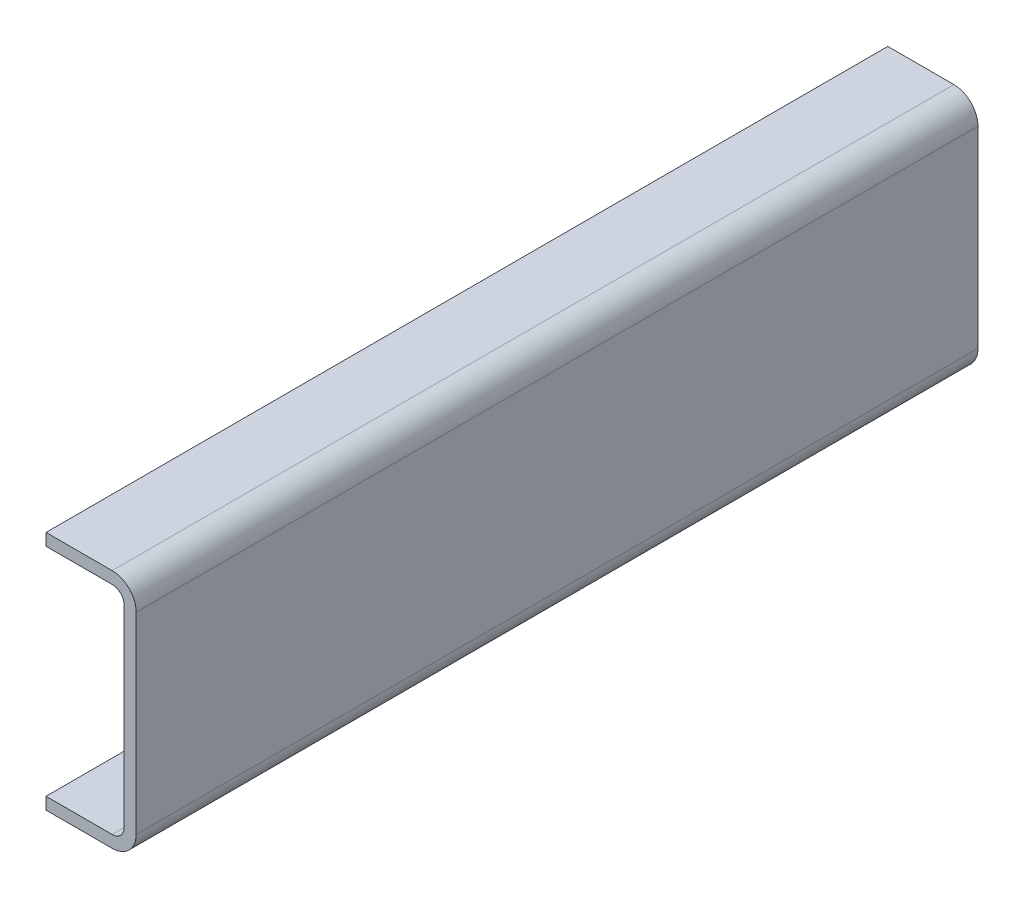
ISO-10303-21;
HEADER;
FILE_DESCRIPTION(('STEP AP214'),'2;1');
FILE_NAME('part.step','',(''),(''),'','','');
FILE_SCHEMA(('AUTOMOTIVE_DESIGN { 1 0 10303 214 1 1 1 1 }'));
ENDSEC;
DATA;
#1=APPLICATION_CONTEXT('core data for automotive mechanical design processes');
#2=APPLICATION_PROTOCOL_DEFINITION('international standard','automotive_design',2000,#1);
#3=PRODUCT_CONTEXT('',#1,'mechanical');
#4=PRODUCT('Part','Part','',(#3));
#5=PRODUCT_RELATED_PRODUCT_CATEGORY('part','',(#4));
#6=PRODUCT_DEFINITION_FORMATION('','',#4);
#7=PRODUCT_DEFINITION_CONTEXT('part definition',#1,'design');
#8=PRODUCT_DEFINITION('design','',#6,#7);
#9=PRODUCT_DEFINITION_SHAPE('','',#8);
#10=(LENGTH_UNIT() NAMED_UNIT(*) SI_UNIT(.MILLI.,.METRE.));
#11=(NAMED_UNIT(*) PLANE_ANGLE_UNIT() SI_UNIT($,.RADIAN.));
#12=(NAMED_UNIT(*) SI_UNIT($,.STERADIAN.) SOLID_ANGLE_UNIT());
#13=UNCERTAINTY_MEASURE_WITH_UNIT(LENGTH_MEASURE(1.E-05),#10,'distance_accuracy_value','');
#14=(GEOMETRIC_REPRESENTATION_CONTEXT(3) GLOBAL_UNCERTAINTY_ASSIGNED_CONTEXT((#13)) GLOBAL_UNIT_ASSIGNED_CONTEXT((#10,
#11,#12)) REPRESENTATION_CONTEXT('',''));
#15=CARTESIAN_POINT('',(0.,0.,0.));
#16=DIRECTION('',(0.,0.,1.));
#17=DIRECTION('',(1.,0.,0.));
#18=AXIS2_PLACEMENT_3D('',#15,#16,#17);
#19=CARTESIAN_POINT('',(-2.54,2.54,88.9));
#20=DIRECTION('',(0.,0.,-1.));
#21=DIRECTION('',(-1.,0.,0.));
#22=AXIS2_PLACEMENT_3D('',#19,#20,#21);
#23=CYLINDRICAL_SURFACE('',#22,2.54);
#24=CARTESIAN_POINT('',(-2.54,2.54,0.));
#25=DIRECTION('',(0.,0.,1.));
#26=DIRECTION('',(-1.,0.,0.));
#27=AXIS2_PLACEMENT_3D('',#24,#25,#26);
#28=CIRCLE('',#27,2.54);
#29=CARTESIAN_POINT('',(-2.54000000000002,0.,0.));
#30=VERTEX_POINT('',#29);
#31=CARTESIAN_POINT('',(0.,2.54000000000002,0.));
#32=VERTEX_POINT('',#31);
#33=EDGE_CURVE('E189',#30,#32,#28,.T.);
#34=ORIENTED_EDGE('',*,*,#33,.T.);
#35=DIRECTION('',(0.,0.,-1.));
#36=VECTOR('',#35,1.);
#37=CARTESIAN_POINT('',(0.,2.54000000000002,88.9));
#38=LINE('',#37,#36);
#39=CARTESIAN_POINT('',(0.,2.54000000000002,88.9));
#40=VERTEX_POINT('',#39);
#41=EDGE_CURVE('E11',#40,#32,#38,.T.);
#42=ORIENTED_EDGE('',*,*,#41,.F.);
#43=CARTESIAN_POINT('',(-2.54,2.54,88.9));
#44=DIRECTION('',(0.,0.,1.));
#45=DIRECTION('',(-1.,0.,0.));
#46=AXIS2_PLACEMENT_3D('',#43,#44,#45);
#47=CIRCLE('',#46,2.54);
#48=CARTESIAN_POINT('',(-2.54000000000002,0.,88.9));
#49=VERTEX_POINT('',#48);
#50=EDGE_CURVE('E223',#49,#40,#47,.T.);
#51=ORIENTED_EDGE('',*,*,#50,.F.);
#52=DIRECTION('',(0.,0.,-1.));
#53=VECTOR('',#52,1.);
#54=CARTESIAN_POINT('',(-2.54000000000002,0.,88.9));
#55=LINE('',#54,#53);
#56=EDGE_CURVE('E185',#49,#30,#55,.T.);
#57=ORIENTED_EDGE('',*,*,#56,.T.);
#58=EDGE_LOOP('',(#34,#42,#51,#57));
#59=FACE_BOUND('',#58,.T.);
#60=ADVANCED_FACE('F40',(#59),#23,.T.);
#61=CARTESIAN_POINT('',(0.,2.54000000000002,88.9));
#62=DIRECTION('',(-1.,0.,0.));
#63=DIRECTION('',(0.,0.,1.));
#64=AXIS2_PLACEMENT_3D('',#61,#62,#63);
#65=PLANE('',#64);
#66=DIRECTION('',(0.,1.,0.));
#67=VECTOR('',#66,1.);
#68=CARTESIAN_POINT('',(0.,2.54000000000002,0.));
#69=LINE('',#68,#67);
#70=CARTESIAN_POINT('',(0.,22.86,0.));
#71=VERTEX_POINT('',#70);
#72=EDGE_CURVE('E193',#32,#71,#69,.T.);
#73=ORIENTED_EDGE('',*,*,#72,.T.);
#74=DIRECTION('',(0.,0.,-1.));
#75=VECTOR('',#74,1.);
#76=CARTESIAN_POINT('',(0.,22.86,88.9));
#77=LINE('',#76,#75);
#78=CARTESIAN_POINT('',(0.,22.86,88.9));
#79=VERTEX_POINT('',#78);
#80=EDGE_CURVE('E49',#79,#71,#77,.T.);
#81=ORIENTED_EDGE('',*,*,#80,.F.);
#82=DIRECTION('',(0.,1.,0.));
#83=VECTOR('',#82,1.);
#84=CARTESIAN_POINT('',(0.,2.54000000000002,88.9));
#85=LINE('',#84,#83);
#86=EDGE_CURVE('E129',#40,#79,#85,.T.);
#87=ORIENTED_EDGE('',*,*,#86,.F.);
#88=ORIENTED_EDGE('',*,*,#41,.T.);
#89=EDGE_LOOP('',(#73,#81,#87,#88));
#90=FACE_BOUND('',#89,.T.);
#91=ADVANCED_FACE('F301',(#90),#65,.F.);
#92=CARTESIAN_POINT('',(-2.54,22.86,88.9));
#93=DIRECTION('',(0.,0.,-1.));
#94=DIRECTION('',(-1.,0.,0.));
#95=AXIS2_PLACEMENT_3D('',#92,#93,#94);
#96=CYLINDRICAL_SURFACE('',#95,2.54);
#97=CARTESIAN_POINT('',(-2.54,22.86,0.));
#98=DIRECTION('',(0.,0.,1.));
#99=DIRECTION('',(1.,0.,0.));
#100=AXIS2_PLACEMENT_3D('',#97,#98,#99);
#101=CIRCLE('',#100,2.54);
#102=CARTESIAN_POINT('',(-2.54000000000002,25.4,0.));
#103=VERTEX_POINT('',#102);
#104=EDGE_CURVE('E196',#71,#103,#101,.T.);
#105=ORIENTED_EDGE('',*,*,#104,.T.);
#106=DIRECTION('',(0.,0.,-1.));
#107=VECTOR('',#106,1.);
#108=CARTESIAN_POINT('',(-2.54000000000002,25.4,88.9));
#109=LINE('',#108,#107);
#110=CARTESIAN_POINT('',(-2.54000000000002,25.4,88.9));
#111=VERTEX_POINT('',#110);
#112=EDGE_CURVE('E250',#111,#103,#109,.T.);
#113=ORIENTED_EDGE('',*,*,#112,.F.);
#114=CARTESIAN_POINT('',(-2.54,22.86,88.9));
#115=DIRECTION('',(0.,0.,1.));
#116=DIRECTION('',(1.,0.,0.));
#117=AXIS2_PLACEMENT_3D('',#114,#115,#116);
#118=CIRCLE('',#117,2.54);
#119=EDGE_CURVE('E261',#79,#111,#118,.T.);
#120=ORIENTED_EDGE('',*,*,#119,.F.);
#121=ORIENTED_EDGE('',*,*,#80,.T.);
#122=EDGE_LOOP('',(#105,#113,#120,#121));
#123=FACE_BOUND('',#122,.T.);
#124=ADVANCED_FACE('F259',(#123),#96,.T.);
#125=CARTESIAN_POINT('',(-2.54000000000002,25.4,88.9));
#126=DIRECTION('',(0.,-1.,0.));
#127=DIRECTION('',(0.,0.,-1.));
#128=AXIS2_PLACEMENT_3D('',#125,#126,#127);
#129=PLANE('',#128);
#130=DIRECTION('',(-1.,0.,0.));
#131=VECTOR('',#130,1.);
#132=CARTESIAN_POINT('',(-2.54000000000002,25.4,0.));
#133=LINE('',#132,#131);
#134=CARTESIAN_POINT('',(-9.525,25.4,0.));
#135=VERTEX_POINT('',#134);
#136=EDGE_CURVE('E199',#103,#135,#133,.T.);
#137=ORIENTED_EDGE('',*,*,#136,.T.);
#138=DIRECTION('',(0.,0.,-1.));
#139=VECTOR('',#138,1.);
#140=CARTESIAN_POINT('',(-9.525,25.4,88.9));
#141=LINE('',#140,#139);
#142=CARTESIAN_POINT('',(-9.525,25.4,88.9));
#143=VERTEX_POINT('',#142);
#144=EDGE_CURVE('E246',#143,#135,#141,.T.);
#145=ORIENTED_EDGE('',*,*,#144,.F.);
#146=DIRECTION('',(-1.,0.,0.));
#147=VECTOR('',#146,1.);
#148=CARTESIAN_POINT('',(-2.54000000000002,25.4,88.9));
#149=LINE('',#148,#147);
#150=EDGE_CURVE('E280',#111,#143,#149,.T.);
#151=ORIENTED_EDGE('',*,*,#150,.F.);
#152=ORIENTED_EDGE('',*,*,#112,.T.);
#153=EDGE_LOOP('',(#137,#145,#151,#152));
#154=FACE_BOUND('',#153,.T.);
#155=ADVANCED_FACE('F270',(#154),#129,.F.);
#156=CARTESIAN_POINT('',(-9.525,25.4,88.9));
#157=DIRECTION('',(1.,0.,0.));
#158=DIRECTION('',(0.,0.,-1.));
#159=AXIS2_PLACEMENT_3D('',#156,#157,#158);
#160=PLANE('',#159);
#161=DIRECTION('',(0.,-1.,0.));
#162=VECTOR('',#161,1.);
#163=CARTESIAN_POINT('',(-9.525,25.4,0.));
#164=LINE('',#163,#162);
#165=CARTESIAN_POINT('',(-9.525,24.13,0.));
#166=VERTEX_POINT('',#165);
#167=EDGE_CURVE('E202',#135,#166,#164,.T.);
#168=ORIENTED_EDGE('',*,*,#167,.T.);
#169=DIRECTION('',(0.,0.,-1.));
#170=VECTOR('',#169,1.);
#171=CARTESIAN_POINT('',(-9.525,24.13,88.9));
#172=LINE('',#171,#170);
#173=CARTESIAN_POINT('',(-9.525,24.13,88.9));
#174=VERTEX_POINT('',#173);
#175=EDGE_CURVE('E242',#174,#166,#172,.T.);
#176=ORIENTED_EDGE('',*,*,#175,.F.);
#177=DIRECTION('',(0.,-1.,0.));
#178=VECTOR('',#177,1.);
#179=CARTESIAN_POINT('',(-9.525,25.4,88.9));
#180=LINE('',#179,#178);
#181=EDGE_CURVE('E276',#143,#174,#180,.T.);
#182=ORIENTED_EDGE('',*,*,#181,.F.);
#183=ORIENTED_EDGE('',*,*,#144,.T.);
#184=EDGE_LOOP('',(#168,#176,#182,#183));
#185=FACE_BOUND('',#184,.T.);
#186=ADVANCED_FACE('F274',(#185),#160,.F.);
#187=CARTESIAN_POINT('',(-2.54000000000001,24.13,88.9));
#188=DIRECTION('',(0.,1.,0.));
#189=DIRECTION('',(0.,0.,1.));
#190=AXIS2_PLACEMENT_3D('',#187,#188,#189);
#191=PLANE('',#190);
#192=DIRECTION('',(1.,0.,0.));
#193=VECTOR('',#192,1.);
#194=CARTESIAN_POINT('',(-2.54000000000001,24.13,0.));
#195=LINE('',#194,#193);
#196=CARTESIAN_POINT('',(-2.54000000000001,24.13,0.));
#197=VERTEX_POINT('',#196);
#198=EDGE_CURVE('E205',#166,#197,#195,.T.);
#199=ORIENTED_EDGE('',*,*,#198,.T.);
#200=DIRECTION('',(0.,0.,-1.));
#201=VECTOR('',#200,1.);
#202=CARTESIAN_POINT('',(-2.54000000000001,24.13,88.9));
#203=LINE('',#202,#201);
#204=CARTESIAN_POINT('',(-2.54000000000001,24.13,88.9));
#205=VERTEX_POINT('',#204);
#206=EDGE_CURVE('E238',#205,#197,#203,.T.);
#207=ORIENTED_EDGE('',*,*,#206,.F.);
#208=DIRECTION('',(1.,0.,0.));
#209=VECTOR('',#208,1.);
#210=CARTESIAN_POINT('',(-2.54000000000001,24.13,88.9));
#211=LINE('',#210,#209);
#212=EDGE_CURVE('E279',#174,#205,#211,.T.);
#213=ORIENTED_EDGE('',*,*,#212,.F.);
#214=ORIENTED_EDGE('',*,*,#175,.T.);
#215=EDGE_LOOP('',(#199,#207,#213,#214));
#216=FACE_BOUND('',#215,.T.);
#217=ADVANCED_FACE('F313',(#216),#191,.F.);
#218=CARTESIAN_POINT('',(-2.54,22.86,88.9));
#219=DIRECTION('',(0.,0.,-1.));
#220=DIRECTION('',(-1.,0.,0.));
#221=AXIS2_PLACEMENT_3D('',#218,#219,#220);
#222=CYLINDRICAL_SURFACE('',#221,1.27);
#223=CARTESIAN_POINT('',(-2.54,22.86,0.));
#224=DIRECTION('',(0.,0.,-1.));
#225=DIRECTION('',(1.,0.,0.));
#226=AXIS2_PLACEMENT_3D('',#223,#224,#225);
#227=CIRCLE('',#226,1.27);
#228=CARTESIAN_POINT('',(-1.27,22.86,0.));
#229=VERTEX_POINT('',#228);
#230=EDGE_CURVE('E208',#197,#229,#227,.T.);
#231=ORIENTED_EDGE('',*,*,#230,.T.);
#232=DIRECTION('',(0.,0.,-1.));
#233=VECTOR('',#232,1.);
#234=CARTESIAN_POINT('',(-1.27,22.86,88.9));
#235=LINE('',#234,#233);
#236=CARTESIAN_POINT('',(-1.27,22.86,88.9));
#237=VERTEX_POINT('',#236);
#238=EDGE_CURVE('E234',#237,#229,#235,.T.);
#239=ORIENTED_EDGE('',*,*,#238,.F.);
#240=CARTESIAN_POINT('',(-2.54,22.86,88.9));
#241=DIRECTION('',(0.,0.,-1.));
#242=DIRECTION('',(1.,0.,0.));
#243=AXIS2_PLACEMENT_3D('',#240,#241,#242);
#244=CIRCLE('',#243,1.27);
#245=EDGE_CURVE('E284',#205,#237,#244,.T.);
#246=ORIENTED_EDGE('',*,*,#245,.F.);
#247=ORIENTED_EDGE('',*,*,#206,.T.);
#248=EDGE_LOOP('',(#231,#239,#246,#247));
#249=FACE_BOUND('',#248,.T.);
#250=ADVANCED_FACE('F316',(#249),#222,.F.);
#251=CARTESIAN_POINT('',(-1.27,2.54000000000001,88.9));
#252=DIRECTION('',(1.,0.,0.));
#253=DIRECTION('',(0.,1.,0.));
#254=AXIS2_PLACEMENT_3D('',#251,#252,#253);
#255=PLANE('',#254);
#256=DIRECTION('',(0.,-1.,0.));
#257=VECTOR('',#256,1.);
#258=CARTESIAN_POINT('',(-1.27,2.54000000000001,0.));
#259=LINE('',#258,#257);
#260=CARTESIAN_POINT('',(-1.27,2.54000000000001,0.));
#261=VERTEX_POINT('',#260);
#262=EDGE_CURVE('E211',#229,#261,#259,.T.);
#263=ORIENTED_EDGE('',*,*,#262,.T.);
#264=DIRECTION('',(0.,0.,-1.));
#265=VECTOR('',#264,1.);
#266=CARTESIAN_POINT('',(-1.27,2.54000000000001,88.9));
#267=LINE('',#266,#265);
#268=CARTESIAN_POINT('',(-1.27,2.54000000000001,88.9));
#269=VERTEX_POINT('',#268);
#270=EDGE_CURVE('E230',#269,#261,#267,.T.);
#271=ORIENTED_EDGE('',*,*,#270,.F.);
#272=DIRECTION('',(0.,-1.,0.));
#273=VECTOR('',#272,1.);
#274=CARTESIAN_POINT('',(-1.27,2.54000000000001,88.9));
#275=LINE('',#274,#273);
#276=EDGE_CURVE('E291',#237,#269,#275,.T.);
#277=ORIENTED_EDGE('',*,*,#276,.F.);
#278=ORIENTED_EDGE('',*,*,#238,.T.);
#279=EDGE_LOOP('',(#263,#271,#277,#278));
#280=FACE_BOUND('',#279,.T.);
#281=ADVANCED_FACE('F320',(#280),#255,.F.);
#282=CARTESIAN_POINT('',(-2.54,2.54,88.9));
#283=DIRECTION('',(0.,0.,-1.));
#284=DIRECTION('',(-1.,0.,0.));
#285=AXIS2_PLACEMENT_3D('',#282,#283,#284);
#286=CYLINDRICAL_SURFACE('',#285,1.27);
#287=CARTESIAN_POINT('',(-2.54,2.54,0.));
#288=DIRECTION('',(0.,0.,-1.));
#289=DIRECTION('',(-1.,0.,0.));
#290=AXIS2_PLACEMENT_3D('',#287,#288,#289);
#291=CIRCLE('',#290,1.27);
#292=CARTESIAN_POINT('',(-2.54000000000002,1.27,0.));
#293=VERTEX_POINT('',#292);
#294=EDGE_CURVE('E214',#261,#293,#291,.T.);
#295=ORIENTED_EDGE('',*,*,#294,.T.);
#296=DIRECTION('',(0.,0.,-1.));
#297=VECTOR('',#296,1.);
#298=CARTESIAN_POINT('',(-2.54000000000002,1.27,88.9));
#299=LINE('',#298,#297);
#300=CARTESIAN_POINT('',(-2.54000000000002,1.27,88.9));
#301=VERTEX_POINT('',#300);
#302=EDGE_CURVE('E178',#301,#293,#299,.T.);
#303=ORIENTED_EDGE('',*,*,#302,.F.);
#304=CARTESIAN_POINT('',(-2.54,2.54,88.9));
#305=DIRECTION('',(0.,0.,-1.));
#306=DIRECTION('',(-1.,0.,0.));
#307=AXIS2_PLACEMENT_3D('',#304,#305,#306);
#308=CIRCLE('',#307,1.27);
#309=EDGE_CURVE('E167',#269,#301,#308,.T.);
#310=ORIENTED_EDGE('',*,*,#309,.F.);
#311=ORIENTED_EDGE('',*,*,#270,.T.);
#312=EDGE_LOOP('',(#295,#303,#310,#311));
#313=FACE_BOUND('',#312,.T.);
#314=ADVANCED_FACE('F324',(#313),#286,.F.);
#315=CARTESIAN_POINT('',(-2.54000000000002,1.27,88.9));
#316=DIRECTION('',(0.,-1.,0.));
#317=DIRECTION('',(0.,0.,-1.));
#318=AXIS2_PLACEMENT_3D('',#315,#316,#317);
#319=PLANE('',#318);
#320=DIRECTION('',(-1.,0.,0.));
#321=VECTOR('',#320,1.);
#322=CARTESIAN_POINT('',(-2.54000000000002,1.27,0.));
#323=LINE('',#322,#321);
#324=CARTESIAN_POINT('',(-9.525,1.27,0.));
#325=VERTEX_POINT('',#324);
#326=EDGE_CURVE('E176',#293,#325,#323,.T.);
#327=ORIENTED_EDGE('',*,*,#326,.T.);
#328=DIRECTION('',(0.,0.,-1.));
#329=VECTOR('',#328,1.);
#330=CARTESIAN_POINT('',(-9.525,1.27,88.9));
#331=LINE('',#330,#329);
#332=CARTESIAN_POINT('',(-9.525,1.27,88.9));
#333=VERTEX_POINT('',#332);
#334=EDGE_CURVE('E173',#333,#325,#331,.T.);
#335=ORIENTED_EDGE('',*,*,#334,.F.);
#336=DIRECTION('',(-1.,0.,0.));
#337=VECTOR('',#336,1.);
#338=CARTESIAN_POINT('',(-2.54000000000002,1.27,88.9));
#339=LINE('',#338,#337);
#340=EDGE_CURVE('E161',#301,#333,#339,.T.);
#341=ORIENTED_EDGE('',*,*,#340,.F.);
#342=ORIENTED_EDGE('',*,*,#302,.T.);
#343=EDGE_LOOP('',(#327,#335,#341,#342));
#344=FACE_BOUND('',#343,.T.);
#345=ADVANCED_FACE('F174',(#344),#319,.F.);
#346=CARTESIAN_POINT('',(-9.525,1.27,88.9));
#347=DIRECTION('',(1.,0.,0.));
#348=DIRECTION('',(0.,0.,-1.));
#349=AXIS2_PLACEMENT_3D('',#346,#347,#348);
#350=PLANE('',#349);
#351=DIRECTION('',(0.,-1.,0.));
#352=VECTOR('',#351,1.);
#353=CARTESIAN_POINT('',(-9.525,1.27,0.));
#354=LINE('',#353,#352);
#355=CARTESIAN_POINT('',(-9.525,0.,0.));
#356=VERTEX_POINT('',#355);
#357=EDGE_CURVE('E112',#325,#356,#354,.T.);
#358=ORIENTED_EDGE('',*,*,#357,.T.);
#359=DIRECTION('',(0.,0.,-1.));
#360=VECTOR('',#359,1.);
#361=CARTESIAN_POINT('',(-9.525,0.,88.9));
#362=LINE('',#361,#360);
#363=CARTESIAN_POINT('',(-9.525,0.,88.9));
#364=VERTEX_POINT('',#363);
#365=EDGE_CURVE('E179',#364,#356,#362,.T.);
#366=ORIENTED_EDGE('',*,*,#365,.F.);
#367=DIRECTION('',(0.,-1.,0.));
#368=VECTOR('',#367,1.);
#369=CARTESIAN_POINT('',(-9.525,1.27,88.9));
#370=LINE('',#369,#368);
#371=EDGE_CURVE('E165',#333,#364,#370,.T.);
#372=ORIENTED_EDGE('',*,*,#371,.F.);
#373=ORIENTED_EDGE('',*,*,#334,.T.);
#374=EDGE_LOOP('',(#358,#366,#372,#373));
#375=FACE_BOUND('',#374,.T.);
#376=ADVANCED_FACE('F181',(#375),#350,.F.);
#377=CARTESIAN_POINT('',(-2.54000000000002,0.,88.9));
#378=DIRECTION('',(0.,1.,0.));
#379=DIRECTION('',(0.,0.,1.));
#380=AXIS2_PLACEMENT_3D('',#377,#378,#379);
#381=PLANE('',#380);
#382=DIRECTION('',(1.,0.,0.));
#383=VECTOR('',#382,1.);
#384=CARTESIAN_POINT('',(-2.54000000000002,0.,0.));
#385=LINE('',#384,#383);
#386=EDGE_CURVE('E119',#356,#30,#385,.T.);
#387=ORIENTED_EDGE('',*,*,#386,.T.);
#388=ORIENTED_EDGE('',*,*,#56,.F.);
#389=DIRECTION('',(1.,0.,0.));
#390=VECTOR('',#389,1.);
#391=CARTESIAN_POINT('',(-2.54000000000002,0.,88.9));
#392=LINE('',#391,#390);
#393=EDGE_CURVE('E60',#364,#49,#392,.T.);
#394=ORIENTED_EDGE('',*,*,#393,.F.);
#395=ORIENTED_EDGE('',*,*,#365,.T.);
#396=EDGE_LOOP('',(#387,#388,#394,#395));
#397=FACE_BOUND('',#396,.T.);
#398=ADVANCED_FACE('F333',(#397),#381,.F.);
#399=CARTESIAN_POINT('',(-2.54,2.54,88.9));
#400=DIRECTION('',(0.,0.,-1.));
#401=DIRECTION('',(-1.,0.,0.));
#402=AXIS2_PLACEMENT_3D('',#399,#400,#401);
#403=PLANE('',#402);
#404=ORIENTED_EDGE('',*,*,#50,.T.);
#405=ORIENTED_EDGE('',*,*,#86,.T.);
#406=ORIENTED_EDGE('',*,*,#119,.T.);
#407=ORIENTED_EDGE('',*,*,#150,.T.);
#408=ORIENTED_EDGE('',*,*,#181,.T.);
#409=ORIENTED_EDGE('',*,*,#212,.T.);
#410=ORIENTED_EDGE('',*,*,#245,.T.);
#411=ORIENTED_EDGE('',*,*,#276,.T.);
#412=ORIENTED_EDGE('',*,*,#309,.T.);
#413=ORIENTED_EDGE('',*,*,#340,.T.);
#414=ORIENTED_EDGE('',*,*,#371,.T.);
#415=ORIENTED_EDGE('',*,*,#393,.T.);
#416=EDGE_LOOP('',(#404,#405,#406,#407,#408,#409,#410,#411,#412,#413,#414,#415));
#417=FACE_BOUND('',#416,.T.);
#418=ADVANCED_FACE('F163',(#417),#403,.F.);
#419=CARTESIAN_POINT('',(-2.54,2.54,0.));
#420=DIRECTION('',(0.,0.,-1.));
#421=DIRECTION('',(-1.,0.,0.));
#422=AXIS2_PLACEMENT_3D('',#419,#420,#421);
#423=PLANE('',#422);
#424=ORIENTED_EDGE('',*,*,#33,.F.);
#425=ORIENTED_EDGE('',*,*,#386,.F.);
#426=ORIENTED_EDGE('',*,*,#357,.F.);
#427=ORIENTED_EDGE('',*,*,#326,.F.);
#428=ORIENTED_EDGE('',*,*,#294,.F.);
#429=ORIENTED_EDGE('',*,*,#262,.F.);
#430=ORIENTED_EDGE('',*,*,#230,.F.);
#431=ORIENTED_EDGE('',*,*,#198,.F.);
#432=ORIENTED_EDGE('',*,*,#167,.F.);
#433=ORIENTED_EDGE('',*,*,#136,.F.);
#434=ORIENTED_EDGE('',*,*,#104,.F.);
#435=ORIENTED_EDGE('',*,*,#72,.F.);
#436=EDGE_LOOP('',(#424,#425,#426,#427,#428,#429,#430,#431,#432,#433,#434,#435));
#437=FACE_BOUND('',#436,.T.);
#438=ADVANCED_FACE('F265',(#437),#423,.T.);
#439=CLOSED_SHELL('',(#60,#91,#124,#155,#186,#217,#250,#281,#314,#345,#376,#398,#418,#438));
#440=MANIFOLD_SOLID_BREP('B2',#439);
#441=ADVANCED_BREP_SHAPE_REPRESENTATION('',(#18,#440),#14);
#442=SHAPE_DEFINITION_REPRESENTATION(#9,#441);
ENDSEC;
END-ISO-10303-21;
